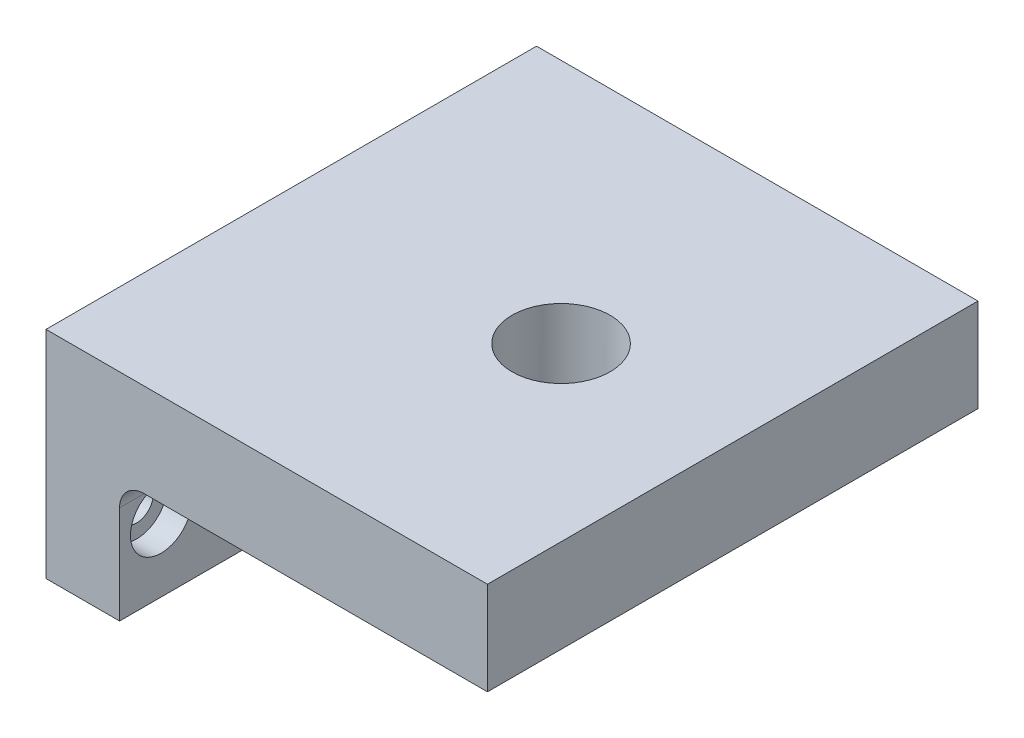
ISO-10303-21;
HEADER;
FILE_DESCRIPTION(('STEP AP214'),'2;1');
FILE_NAME('part.step','',(''),(''),'','','');
FILE_SCHEMA(('AUTOMOTIVE_DESIGN { 1 0 10303 214 1 1 1 1 }'));
ENDSEC;
DATA;
#1=APPLICATION_CONTEXT('core data for automotive mechanical design processes');
#2=APPLICATION_PROTOCOL_DEFINITION('international standard','automotive_design',2000,#1);
#3=PRODUCT_CONTEXT('',#1,'mechanical');
#4=PRODUCT('Part','Part','',(#3));
#5=PRODUCT_RELATED_PRODUCT_CATEGORY('part','',(#4));
#6=PRODUCT_DEFINITION_FORMATION('','',#4);
#7=PRODUCT_DEFINITION_CONTEXT('part definition',#1,'design');
#8=PRODUCT_DEFINITION('design','',#6,#7);
#9=PRODUCT_DEFINITION_SHAPE('','',#8);
#10=(LENGTH_UNIT() NAMED_UNIT(*) SI_UNIT(.MILLI.,.METRE.));
#11=(NAMED_UNIT(*) PLANE_ANGLE_UNIT() SI_UNIT($,.RADIAN.));
#12=(NAMED_UNIT(*) SI_UNIT($,.STERADIAN.) SOLID_ANGLE_UNIT());
#13=UNCERTAINTY_MEASURE_WITH_UNIT(LENGTH_MEASURE(1.E-05),#10,'distance_accuracy_value','');
#14=(GEOMETRIC_REPRESENTATION_CONTEXT(3) GLOBAL_UNCERTAINTY_ASSIGNED_CONTEXT((#13)) GLOBAL_UNIT_ASSIGNED_CONTEXT((#10,
#11,#12)) REPRESENTATION_CONTEXT('',''));
#15=CARTESIAN_POINT('',(0.,0.,0.));
#16=DIRECTION('',(0.,0.,1.));
#17=DIRECTION('',(1.,0.,0.));
#18=AXIS2_PLACEMENT_3D('',#15,#16,#17);
#19=CARTESIAN_POINT('',(45.72,-15.24,46.5));
#20=DIRECTION('',(-1.,0.,0.));
#21=DIRECTION('',(0.,-1.,0.));
#22=AXIS2_PLACEMENT_3D('',#19,#20,#21);
#23=CYLINDRICAL_SURFACE('',#22,1.7399);
#24=CARTESIAN_POINT('',(0.,-15.24,46.5));
#25=DIRECTION('',(-1.,0.,0.));
#26=DIRECTION('',(0.,-1.,0.));
#27=AXIS2_PLACEMENT_3D('',#24,#25,#26);
#28=CIRCLE('',#27,1.7399);
#29=CARTESIAN_POINT('',(0.,-16.9799,46.5));
#30=VERTEX_POINT('',#29);
#31=EDGE_CURVE('E161',#30,#30,#28,.T.);
#32=ORIENTED_EDGE('',*,*,#31,.T.);
#33=EDGE_LOOP('',(#32));
#34=FACE_BOUND('',#33,.T.);
#35=CARTESIAN_POINT('',(5.08,-15.24,46.5));
#36=DIRECTION('',(1.,0.,0.));
#37=DIRECTION('',(0.,1.,0.));
#38=AXIS2_PLACEMENT_3D('',#35,#36,#37);
#39=CIRCLE('',#38,1.7399);
#40=CARTESIAN_POINT('',(5.08,-13.5001,46.5));
#41=VERTEX_POINT('',#40);
#42=EDGE_CURVE('E157',#41,#41,#39,.F.);
#43=ORIENTED_EDGE('',*,*,#42,.F.);
#44=EDGE_LOOP('',(#43));
#45=FACE_BOUND('',#44,.T.);
#46=ADVANCED_FACE('F45',(#34,#45),#23,.F.);
#47=CARTESIAN_POINT('',(0.,0.,50.8));
#48=DIRECTION('',(0.,-1.,0.));
#49=DIRECTION('',(0.,0.,-1.));
#50=AXIS2_PLACEMENT_3D('',#47,#48,#49);
#51=PLANE('',#50);
#52=CARTESIAN_POINT('',(27.94,0.,25.4));
#53=DIRECTION('',(0.,1.,0.));
#54=DIRECTION('',(0.,0.,1.));
#55=AXIS2_PLACEMENT_3D('',#52,#53,#54);
#56=CIRCLE('',#55,5.08000000000001);
#57=CARTESIAN_POINT('',(27.94,0.,30.48));
#58=VERTEX_POINT('',#57);
#59=EDGE_CURVE('E415',#58,#58,#56,.T.);
#60=ORIENTED_EDGE('',*,*,#59,.F.);
#61=EDGE_LOOP('',(#60));
#62=FACE_BOUND('',#61,.T.);
#63=DIRECTION('',(-1.,0.,0.));
#64=VECTOR('',#63,1.);
#65=CARTESIAN_POINT('',(0.,0.,0.));
#66=LINE('',#65,#64);
#67=CARTESIAN_POINT('',(45.72,0.,0.));
#68=VERTEX_POINT('',#67);
#69=CARTESIAN_POINT('',(0.,0.,0.));
#70=VERTEX_POINT('',#69);
#71=EDGE_CURVE('E172',#68,#70,#66,.T.);
#72=ORIENTED_EDGE('',*,*,#71,.T.);
#73=DIRECTION('',(0.,0.,-1.));
#74=VECTOR('',#73,1.);
#75=CARTESIAN_POINT('',(0.,0.,50.8));
#76=LINE('',#75,#74);
#77=CARTESIAN_POINT('',(0.,0.,50.8));
#78=VERTEX_POINT('',#77);
#79=EDGE_CURVE('E229',#78,#70,#76,.T.);
#80=ORIENTED_EDGE('',*,*,#79,.F.);
#81=DIRECTION('',(-1.,0.,0.));
#82=VECTOR('',#81,1.);
#83=CARTESIAN_POINT('',(0.,0.,50.8));
#84=LINE('',#83,#82);
#85=CARTESIAN_POINT('',(45.72,0.,50.8));
#86=VERTEX_POINT('',#85);
#87=EDGE_CURVE('E176',#86,#78,#84,.T.);
#88=ORIENTED_EDGE('',*,*,#87,.F.);
#89=DIRECTION('',(0.,0.,-1.));
#90=VECTOR('',#89,1.);
#91=CARTESIAN_POINT('',(45.72,0.,50.8));
#92=LINE('',#91,#90);
#93=EDGE_CURVE('E197',#86,#68,#92,.T.);
#94=ORIENTED_EDGE('',*,*,#93,.T.);
#95=EDGE_LOOP('',(#72,#80,#88,#94));
#96=FACE_BOUND('',#95,.T.);
#97=ADVANCED_FACE('F260',(#62,#96),#51,.F.);
#98=CARTESIAN_POINT('',(0.,0.,50.8));
#99=DIRECTION('',(1.,0.,0.));
#100=DIRECTION('',(0.,1.,0.));
#101=AXIS2_PLACEMENT_3D('',#98,#99,#100);
#102=PLANE('',#101);
#103=CARTESIAN_POINT('',(0.,-15.24,4.3));
#104=DIRECTION('',(-1.,0.,0.));
#105=DIRECTION('',(0.,-1.,0.));
#106=AXIS2_PLACEMENT_3D('',#103,#104,#105);
#107=CIRCLE('',#106,1.7399);
#108=CARTESIAN_POINT('',(0.,-16.9799,4.3));
#109=VERTEX_POINT('',#108);
#110=EDGE_CURVE('E166',#109,#109,#107,.T.);
#111=ORIENTED_EDGE('',*,*,#110,.F.);
#112=EDGE_LOOP('',(#111));
#113=FACE_BOUND('',#112,.T.);
#114=ORIENTED_EDGE('',*,*,#31,.F.);
#115=EDGE_LOOP('',(#114));
#116=FACE_BOUND('',#115,.T.);
#117=DIRECTION('',(0.,-1.,0.));
#118=VECTOR('',#117,1.);
#119=CARTESIAN_POINT('',(0.,0.,0.));
#120=LINE('',#119,#118);
#121=CARTESIAN_POINT('',(0.,-22.352,0.));
#122=VERTEX_POINT('',#121);
#123=EDGE_CURVE('E201',#70,#122,#120,.T.);
#124=ORIENTED_EDGE('',*,*,#123,.T.);
#125=DIRECTION('',(0.,0.,-1.));
#126=VECTOR('',#125,1.);
#127=CARTESIAN_POINT('',(0.,-22.352,50.8));
#128=LINE('',#127,#126);
#129=CARTESIAN_POINT('',(0.,-22.352,50.8));
#130=VERTEX_POINT('',#129);
#131=EDGE_CURVE('E226',#130,#122,#128,.T.);
#132=ORIENTED_EDGE('',*,*,#131,.F.);
#133=DIRECTION('',(0.,-1.,0.));
#134=VECTOR('',#133,1.);
#135=CARTESIAN_POINT('',(0.,0.,50.8));
#136=LINE('',#135,#134);
#137=EDGE_CURVE('E180',#78,#130,#136,.T.);
#138=ORIENTED_EDGE('',*,*,#137,.F.);
#139=ORIENTED_EDGE('',*,*,#79,.T.);
#140=EDGE_LOOP('',(#124,#132,#138,#139));
#141=FACE_BOUND('',#140,.T.);
#142=ADVANCED_FACE('F255',(#113,#116,#141),#102,.F.);
#143=CARTESIAN_POINT('',(7.62,-22.352,50.8));
#144=DIRECTION('',(0.,1.,0.));
#145=DIRECTION('',(-1.,0.,0.));
#146=AXIS2_PLACEMENT_3D('',#143,#144,#145);
#147=PLANE('',#146);
#148=DIRECTION('',(1.,0.,0.));
#149=VECTOR('',#148,1.);
#150=CARTESIAN_POINT('',(7.62,-22.352,0.));
#151=LINE('',#150,#149);
#152=CARTESIAN_POINT('',(7.62,-22.352,0.));
#153=VERTEX_POINT('',#152);
#154=EDGE_CURVE('E204',#122,#153,#151,.T.);
#155=ORIENTED_EDGE('',*,*,#154,.T.);
#156=DIRECTION('',(0.,0.,-1.));
#157=VECTOR('',#156,1.);
#158=CARTESIAN_POINT('',(7.62,-22.352,50.8));
#159=LINE('',#158,#157);
#160=CARTESIAN_POINT('',(7.62,-22.352,50.8));
#161=VERTEX_POINT('',#160);
#162=EDGE_CURVE('E222',#161,#153,#159,.T.);
#163=ORIENTED_EDGE('',*,*,#162,.F.);
#164=DIRECTION('',(1.,0.,0.));
#165=VECTOR('',#164,1.);
#166=CARTESIAN_POINT('',(7.62,-22.352,50.8));
#167=LINE('',#166,#165);
#168=EDGE_CURVE('E184',#130,#161,#167,.T.);
#169=ORIENTED_EDGE('',*,*,#168,.F.);
#170=ORIENTED_EDGE('',*,*,#131,.T.);
#171=EDGE_LOOP('',(#155,#163,#169,#170));
#172=FACE_BOUND('',#171,.T.);
#173=ADVANCED_FACE('F253',(#172),#147,.F.);
#174=CARTESIAN_POINT('',(7.62,-9.652,50.8));
#175=DIRECTION('',(-1.,0.,0.));
#176=DIRECTION('',(0.,0.,1.));
#177=AXIS2_PLACEMENT_3D('',#174,#175,#176);
#178=PLANE('',#177);
#179=DIRECTION('',(0.,0.,-1.));
#180=VECTOR('',#179,1.);
#181=CARTESIAN_POINT('',(7.62,-12.192,50.8));
#182=LINE('',#181,#180);
#183=CARTESIAN_POINT('',(7.62,-12.192,5.18900000000001));
#184=VERTEX_POINT('',#183);
#185=CARTESIAN_POINT('',(7.62,-12.192,45.611));
#186=VERTEX_POINT('',#185);
#187=EDGE_CURVE('E125',#184,#186,#182,.F.);
#188=ORIENTED_EDGE('',*,*,#187,.T.);
#189=CARTESIAN_POINT('',(7.62,-15.24,46.5));
#190=DIRECTION('',(1.,0.,0.));
#191=DIRECTION('',(0.,1.,0.));
#192=AXIS2_PLACEMENT_3D('',#189,#190,#191);
#193=CIRCLE('',#192,3.175);
#194=CARTESIAN_POINT('',(7.62,-12.192,47.389));
#195=VERTEX_POINT('',#194);
#196=EDGE_CURVE('E62',#195,#186,#193,.T.);
#197=ORIENTED_EDGE('',*,*,#196,.F.);
#198=CARTESIAN_POINT('',(7.62,-12.192,50.8));
#199=VERTEX_POINT('',#198);
#200=EDGE_CURVE('E146',#195,#199,#182,.F.);
#201=ORIENTED_EDGE('',*,*,#200,.T.);
#202=DIRECTION('',(0.,1.,0.));
#203=VECTOR('',#202,1.);
#204=CARTESIAN_POINT('',(7.62,-9.652,50.8));
#205=LINE('',#204,#203);
#206=EDGE_CURVE('E187',#161,#199,#205,.T.);
#207=ORIENTED_EDGE('',*,*,#206,.F.);
#208=ORIENTED_EDGE('',*,*,#162,.T.);
#209=DIRECTION('',(0.,1.,0.));
#210=VECTOR('',#209,1.);
#211=CARTESIAN_POINT('',(7.62,-9.652,0.));
#212=LINE('',#211,#210);
#213=CARTESIAN_POINT('',(7.62,-12.192,0.));
#214=VERTEX_POINT('',#213);
#215=EDGE_CURVE('E207',#153,#214,#212,.T.);
#216=ORIENTED_EDGE('',*,*,#215,.T.);
#217=CARTESIAN_POINT('',(7.62,-12.192,3.41099999999999));
#218=VERTEX_POINT('',#217);
#219=EDGE_CURVE('E124',#214,#218,#182,.F.);
#220=ORIENTED_EDGE('',*,*,#219,.T.);
#221=CARTESIAN_POINT('',(7.62,-15.24,4.3));
#222=DIRECTION('',(1.,0.,0.));
#223=DIRECTION('',(0.,-1.,0.));
#224=AXIS2_PLACEMENT_3D('',#221,#222,#223);
#225=CIRCLE('',#224,3.175);
#226=EDGE_CURVE('E130',#184,#218,#225,.T.);
#227=ORIENTED_EDGE('',*,*,#226,.F.);
#228=EDGE_LOOP('',(#188,#197,#201,#207,#208,#216,#220,#227));
#229=FACE_BOUND('',#228,.T.);
#230=ADVANCED_FACE('F136',(#229),#178,.F.);
#231=CARTESIAN_POINT('',(45.72,-9.652,50.8));
#232=DIRECTION('',(0.,1.,0.));
#233=DIRECTION('',(-1.,0.,0.));
#234=AXIS2_PLACEMENT_3D('',#231,#232,#233);
#235=PLANE('',#234);
#236=CARTESIAN_POINT('',(27.94,-9.652,25.4));
#237=DIRECTION('',(0.,1.,0.));
#238=DIRECTION('',(-1.,0.,0.));
#239=AXIS2_PLACEMENT_3D('',#236,#237,#238);
#240=CIRCLE('',#239,5.08000000000001);
#241=CARTESIAN_POINT('',(22.86,-9.652,25.4));
#242=VERTEX_POINT('',#241);
#243=EDGE_CURVE('E49',#242,#242,#240,.T.);
#244=ORIENTED_EDGE('',*,*,#243,.T.);
#245=EDGE_LOOP('',(#244));
#246=FACE_BOUND('',#245,.T.);
#247=DIRECTION('',(1.,0.,0.));
#248=VECTOR('',#247,1.);
#249=CARTESIAN_POINT('',(45.72,-9.652,50.8));
#250=LINE('',#249,#248);
#251=CARTESIAN_POINT('',(10.16,-9.652,50.8));
#252=VERTEX_POINT('',#251);
#253=CARTESIAN_POINT('',(45.72,-9.652,50.8));
#254=VERTEX_POINT('',#253);
#255=EDGE_CURVE('E191',#252,#254,#250,.T.);
#256=ORIENTED_EDGE('',*,*,#255,.F.);
#257=DIRECTION('',(0.,0.,-1.));
#258=VECTOR('',#257,1.);
#259=CARTESIAN_POINT('',(10.16,-9.652,0.));
#260=LINE('',#259,#258);
#261=CARTESIAN_POINT('',(10.16,-9.652,0.));
#262=VERTEX_POINT('',#261);
#263=EDGE_CURVE('E150',#252,#262,#260,.T.);
#264=ORIENTED_EDGE('',*,*,#263,.T.);
#265=DIRECTION('',(1.,0.,0.));
#266=VECTOR('',#265,1.);
#267=CARTESIAN_POINT('',(45.72,-9.652,0.));
#268=LINE('',#267,#266);
#269=CARTESIAN_POINT('',(45.72,-9.652,0.));
#270=VERTEX_POINT('',#269);
#271=EDGE_CURVE('E210',#262,#270,#268,.T.);
#272=ORIENTED_EDGE('',*,*,#271,.T.);
#273=DIRECTION('',(0.,0.,-1.));
#274=VECTOR('',#273,1.);
#275=CARTESIAN_POINT('',(45.72,-9.652,50.8));
#276=LINE('',#275,#274);
#277=EDGE_CURVE('E218',#254,#270,#276,.T.);
#278=ORIENTED_EDGE('',*,*,#277,.F.);
#279=EDGE_LOOP('',(#256,#264,#272,#278));
#280=FACE_BOUND('',#279,.T.);
#281=ADVANCED_FACE('F264',(#246,#280),#235,.F.);
#282=CARTESIAN_POINT('',(45.72,0.,50.8));
#283=DIRECTION('',(-1.,0.,0.));
#284=DIRECTION('',(0.,0.,1.));
#285=AXIS2_PLACEMENT_3D('',#282,#283,#284);
#286=PLANE('',#285);
#287=DIRECTION('',(0.,1.,0.));
#288=VECTOR('',#287,1.);
#289=CARTESIAN_POINT('',(45.72,0.,0.));
#290=LINE('',#289,#288);
#291=EDGE_CURVE('E181',#270,#68,#290,.T.);
#292=ORIENTED_EDGE('',*,*,#291,.T.);
#293=ORIENTED_EDGE('',*,*,#93,.F.);
#294=DIRECTION('',(0.,1.,0.));
#295=VECTOR('',#294,1.);
#296=CARTESIAN_POINT('',(45.72,0.,50.8));
#297=LINE('',#296,#295);
#298=EDGE_CURVE('E194',#254,#86,#297,.T.);
#299=ORIENTED_EDGE('',*,*,#298,.F.);
#300=ORIENTED_EDGE('',*,*,#277,.T.);
#301=EDGE_LOOP('',(#292,#293,#299,#300));
#302=FACE_BOUND('',#301,.T.);
#303=ADVANCED_FACE('F262',(#302),#286,.F.);
#304=CARTESIAN_POINT('',(0.,0.,50.8));
#305=DIRECTION('',(0.,0.,-1.));
#306=DIRECTION('',(-1.,0.,0.));
#307=AXIS2_PLACEMENT_3D('',#304,#305,#306);
#308=PLANE('',#307);
#309=ORIENTED_EDGE('',*,*,#87,.T.);
#310=ORIENTED_EDGE('',*,*,#137,.T.);
#311=ORIENTED_EDGE('',*,*,#168,.T.);
#312=ORIENTED_EDGE('',*,*,#206,.T.);
#313=CARTESIAN_POINT('',(10.16,-12.192,50.8));
#314=DIRECTION('',(0.,0.,-1.));
#315=DIRECTION('',(-1.,0.,0.));
#316=AXIS2_PLACEMENT_3D('',#313,#314,#315);
#317=CIRCLE('',#316,2.54);
#318=EDGE_CURVE('E11',#199,#252,#317,.T.);
#319=ORIENTED_EDGE('',*,*,#318,.T.);
#320=ORIENTED_EDGE('',*,*,#255,.T.);
#321=ORIENTED_EDGE('',*,*,#298,.T.);
#322=EDGE_LOOP('',(#309,#310,#311,#312,#319,#320,#321));
#323=FACE_BOUND('',#322,.T.);
#324=ADVANCED_FACE('F243',(#323),#308,.F.);
#325=CARTESIAN_POINT('',(0.,0.,0.));
#326=DIRECTION('',(0.,0.,-1.));
#327=DIRECTION('',(-1.,0.,0.));
#328=AXIS2_PLACEMENT_3D('',#325,#326,#327);
#329=PLANE('',#328);
#330=ORIENTED_EDGE('',*,*,#71,.F.);
#331=ORIENTED_EDGE('',*,*,#291,.F.);
#332=ORIENTED_EDGE('',*,*,#271,.F.);
#333=CARTESIAN_POINT('',(10.16,-12.192,0.));
#334=DIRECTION('',(0.,0.,-1.));
#335=DIRECTION('',(-1.,0.,0.));
#336=AXIS2_PLACEMENT_3D('',#333,#334,#335);
#337=CIRCLE('',#336,2.54);
#338=EDGE_CURVE('E55',#262,#214,#337,.F.);
#339=ORIENTED_EDGE('',*,*,#338,.T.);
#340=ORIENTED_EDGE('',*,*,#215,.F.);
#341=ORIENTED_EDGE('',*,*,#154,.F.);
#342=ORIENTED_EDGE('',*,*,#123,.F.);
#343=EDGE_LOOP('',(#330,#331,#332,#339,#340,#341,#342));
#344=FACE_BOUND('',#343,.T.);
#345=ADVANCED_FACE('F249',(#344),#329,.T.);
#346=CARTESIAN_POINT('',(45.72,-15.24,4.3));
#347=DIRECTION('',(-1.,0.,0.));
#348=DIRECTION('',(0.,-1.,0.));
#349=AXIS2_PLACEMENT_3D('',#346,#347,#348);
#350=CYLINDRICAL_SURFACE('',#349,1.7399);
#351=CARTESIAN_POINT('',(5.08,-15.24,4.3));
#352=DIRECTION('',(-1.,0.,0.));
#353=DIRECTION('',(0.,-1.,0.));
#354=AXIS2_PLACEMENT_3D('',#351,#352,#353);
#355=CIRCLE('',#354,1.7399);
#356=CARTESIAN_POINT('',(5.08,-16.9799,4.3));
#357=VERTEX_POINT('',#356);
#358=EDGE_CURVE('E154',#357,#357,#355,.F.);
#359=ORIENTED_EDGE('',*,*,#358,.T.);
#360=EDGE_LOOP('',(#359));
#361=FACE_BOUND('',#360,.T.);
#362=ORIENTED_EDGE('',*,*,#110,.T.);
#363=EDGE_LOOP('',(#362));
#364=FACE_BOUND('',#363,.T.);
#365=ADVANCED_FACE('F286',(#361,#364),#350,.F.);
#366=CARTESIAN_POINT('',(10.16,-12.192,50.8));
#367=DIRECTION('',(0.,0.,1.));
#368=DIRECTION('',(1.,0.,0.));
#369=AXIS2_PLACEMENT_3D('',#366,#367,#368);
#370=CYLINDRICAL_SURFACE('',#369,2.54);
#371=ORIENTED_EDGE('',*,*,#318,.F.);
#372=ORIENTED_EDGE('',*,*,#200,.F.);
#373=EDGE_CURVE('E143',#186,#195,#182,.F.);
#374=ORIENTED_EDGE('',*,*,#373,.F.);
#375=ORIENTED_EDGE('',*,*,#187,.F.);
#376=EDGE_CURVE('E117',#218,#184,#182,.F.);
#377=ORIENTED_EDGE('',*,*,#376,.F.);
#378=ORIENTED_EDGE('',*,*,#219,.F.);
#379=ORIENTED_EDGE('',*,*,#338,.F.);
#380=ORIENTED_EDGE('',*,*,#263,.F.);
#381=EDGE_LOOP('',(#371,#372,#374,#375,#377,#378,#379,#380));
#382=FACE_BOUND('',#381,.T.);
#383=ADVANCED_FACE('F47',(#382),#370,.F.);
#384=CARTESIAN_POINT('',(5.08,-15.24,4.3));
#385=DIRECTION('',(-1.,0.,0.));
#386=DIRECTION('',(0.,-1.,0.));
#387=AXIS2_PLACEMENT_3D('',#384,#385,#386);
#388=PLANE('',#387);
#389=CARTESIAN_POINT('',(5.08,-15.24,4.3));
#390=DIRECTION('',(1.,0.,0.));
#391=DIRECTION('',(0.,-1.,0.));
#392=AXIS2_PLACEMENT_3D('',#389,#390,#391);
#393=CIRCLE('',#392,3.175);
#394=CARTESIAN_POINT('',(5.08,-18.415,4.3));
#395=VERTEX_POINT('',#394);
#396=EDGE_CURVE('E139',#395,#395,#393,.T.);
#397=ORIENTED_EDGE('',*,*,#396,.T.);
#398=EDGE_LOOP('',(#397));
#399=FACE_BOUND('',#398,.T.);
#400=ORIENTED_EDGE('',*,*,#358,.F.);
#401=EDGE_LOOP('',(#400));
#402=FACE_BOUND('',#401,.T.);
#403=ADVANCED_FACE('F297',(#399,#402),#388,.F.);
#404=CARTESIAN_POINT('',(5.08,-15.24,4.3));
#405=DIRECTION('',(1.,0.,0.));
#406=DIRECTION('',(0.,1.,0.));
#407=AXIS2_PLACEMENT_3D('',#404,#405,#406);
#408=CYLINDRICAL_SURFACE('',#407,3.175);
#409=ORIENTED_EDGE('',*,*,#396,.F.);
#410=EDGE_LOOP('',(#409));
#411=FACE_BOUND('',#410,.T.);
#412=EDGE_CURVE('E69',#218,#184,#225,.T.);
#413=ORIENTED_EDGE('',*,*,#412,.T.);
#414=ORIENTED_EDGE('',*,*,#226,.T.);
#415=EDGE_LOOP('',(#413,#414));
#416=FACE_BOUND('',#415,.T.);
#417=ADVANCED_FACE('F129',(#411,#416),#408,.F.);
#418=CARTESIAN_POINT('',(7.62,-15.24,4.3));
#419=DIRECTION('',(-1.,0.,0.));
#420=DIRECTION('',(0.,-1.,0.));
#421=AXIS2_PLACEMENT_3D('',#418,#419,#420);
#422=PLANE('',#421);
#423=ORIENTED_EDGE('',*,*,#412,.F.);
#424=ORIENTED_EDGE('',*,*,#376,.T.);
#425=EDGE_LOOP('',(#423,#424));
#426=FACE_BOUND('',#425,.T.);
#427=ADVANCED_FACE('F118',(#426),#422,.T.);
#428=CARTESIAN_POINT('',(5.08,-15.24,46.5));
#429=DIRECTION('',(1.,0.,0.));
#430=DIRECTION('',(0.,1.,0.));
#431=AXIS2_PLACEMENT_3D('',#428,#429,#430);
#432=PLANE('',#431);
#433=CARTESIAN_POINT('',(5.08,-15.24,46.5));
#434=DIRECTION('',(1.,0.,0.));
#435=DIRECTION('',(0.,1.,0.));
#436=AXIS2_PLACEMENT_3D('',#433,#434,#435);
#437=CIRCLE('',#436,3.175);
#438=CARTESIAN_POINT('',(5.08,-12.065,46.5));
#439=VERTEX_POINT('',#438);
#440=EDGE_CURVE('E158',#439,#439,#437,.T.);
#441=ORIENTED_EDGE('',*,*,#440,.T.);
#442=EDGE_LOOP('',(#441));
#443=FACE_BOUND('',#442,.T.);
#444=ORIENTED_EDGE('',*,*,#42,.T.);
#445=EDGE_LOOP('',(#444));
#446=FACE_BOUND('',#445,.T.);
#447=ADVANCED_FACE('F371',(#443,#446),#432,.T.);
#448=CARTESIAN_POINT('',(7.62,-15.24,46.5));
#449=DIRECTION('',(1.,0.,0.));
#450=DIRECTION('',(0.,1.,0.));
#451=AXIS2_PLACEMENT_3D('',#448,#449,#450);
#452=PLANE('',#451);
#453=EDGE_CURVE('E132',#186,#195,#193,.T.);
#454=ORIENTED_EDGE('',*,*,#453,.F.);
#455=ORIENTED_EDGE('',*,*,#373,.T.);
#456=EDGE_LOOP('',(#454,#455));
#457=FACE_BOUND('',#456,.T.);
#458=ADVANCED_FACE('F380',(#457),#452,.F.);
#459=CARTESIAN_POINT('',(5.08,-15.24,46.5));
#460=DIRECTION('',(1.,0.,0.));
#461=DIRECTION('',(0.,1.,0.));
#462=AXIS2_PLACEMENT_3D('',#459,#460,#461);
#463=CYLINDRICAL_SURFACE('',#462,3.175);
#464=ORIENTED_EDGE('',*,*,#440,.F.);
#465=EDGE_LOOP('',(#464));
#466=FACE_BOUND('',#465,.T.);
#467=ORIENTED_EDGE('',*,*,#196,.T.);
#468=ORIENTED_EDGE('',*,*,#453,.T.);
#469=EDGE_LOOP('',(#467,#468));
#470=FACE_BOUND('',#469,.T.);
#471=ADVANCED_FACE('F390',(#466,#470),#463,.F.);
#472=CARTESIAN_POINT('',(27.94,-22.352,25.4));
#473=DIRECTION('',(0.,1.,0.));
#474=DIRECTION('',(0.,0.,1.));
#475=AXIS2_PLACEMENT_3D('',#472,#473,#474);
#476=CYLINDRICAL_SURFACE('',#475,5.08000000000001);
#477=ORIENTED_EDGE('',*,*,#59,.T.);
#478=EDGE_LOOP('',(#477));
#479=FACE_BOUND('',#478,.T.);
#480=ORIENTED_EDGE('',*,*,#243,.F.);
#481=EDGE_LOOP('',(#480));
#482=FACE_BOUND('',#481,.T.);
#483=ADVANCED_FACE('F400',(#479,#482),#476,.F.);
#484=CLOSED_SHELL('',(#46,#97,#142,#173,#230,#281,#303,#324,#345,#365,#383,#403,#417,#427,#447,
#458,#471,#483));
#485=MANIFOLD_SOLID_BREP('B2',#484);
#486=ADVANCED_BREP_SHAPE_REPRESENTATION('',(#18,#485),#14);
#487=SHAPE_DEFINITION_REPRESENTATION(#9,#486);
ENDSEC;
END-ISO-10303-21;
